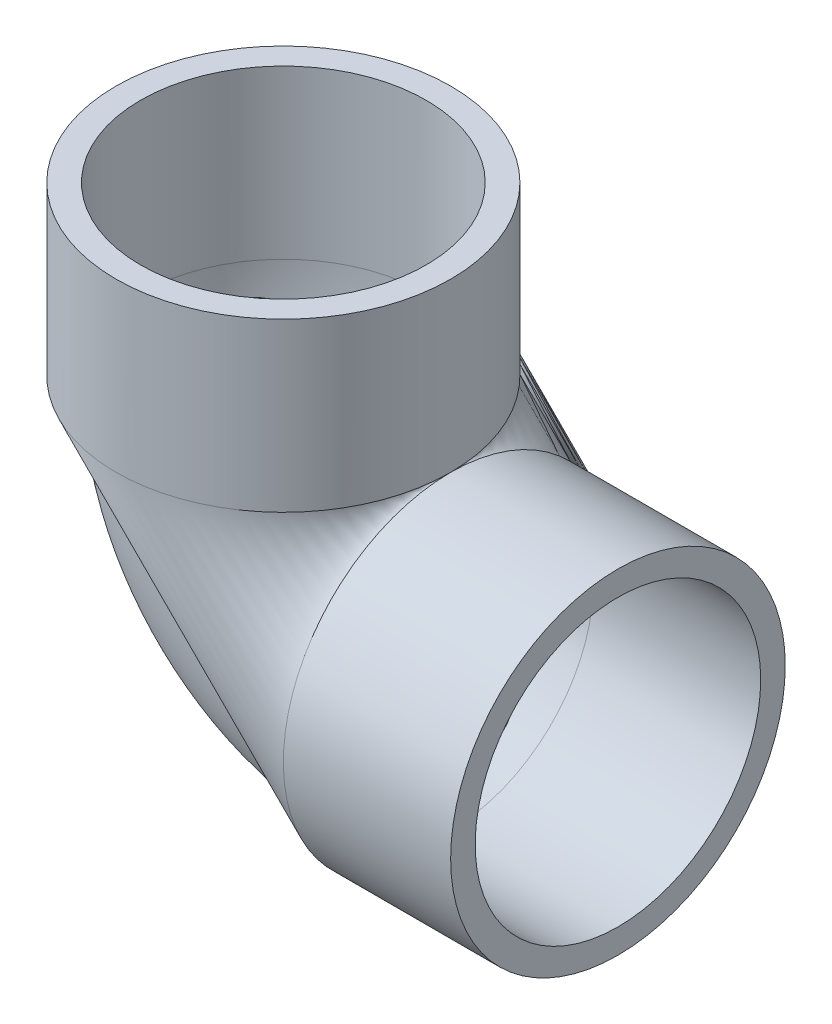
ISO-10303-21;
HEADER;
FILE_DESCRIPTION(('STEP AP214'),'2;1');
FILE_NAME('part.step','',(''),(''),'','','');
FILE_SCHEMA(('AUTOMOTIVE_DESIGN { 1 0 10303 214 1 1 1 1 }'));
ENDSEC;
DATA;
#1=APPLICATION_CONTEXT('core data for automotive mechanical design processes');
#2=APPLICATION_PROTOCOL_DEFINITION('international standard','automotive_design',2000,#1);
#3=PRODUCT_CONTEXT('',#1,'mechanical');
#4=PRODUCT('Part','Part','',(#3));
#5=PRODUCT_RELATED_PRODUCT_CATEGORY('part','',(#4));
#6=PRODUCT_DEFINITION_FORMATION('','',#4);
#7=PRODUCT_DEFINITION_CONTEXT('part definition',#1,'design');
#8=PRODUCT_DEFINITION('design','',#6,#7);
#9=PRODUCT_DEFINITION_SHAPE('','',#8);
#10=(LENGTH_UNIT() NAMED_UNIT(*) SI_UNIT(.MILLI.,.METRE.));
#11=(NAMED_UNIT(*) PLANE_ANGLE_UNIT() SI_UNIT($,.RADIAN.));
#12=(NAMED_UNIT(*) SI_UNIT($,.STERADIAN.) SOLID_ANGLE_UNIT());
#13=UNCERTAINTY_MEASURE_WITH_UNIT(LENGTH_MEASURE(1.E-05),#10,'distance_accuracy_value','');
#14=(GEOMETRIC_REPRESENTATION_CONTEXT(3) GLOBAL_UNCERTAINTY_ASSIGNED_CONTEXT((#13)) GLOBAL_UNIT_ASSIGNED_CONTEXT((#10,
#11,#12)) REPRESENTATION_CONTEXT('',''));
#15=CARTESIAN_POINT('',(0.,0.,0.));
#16=DIRECTION('',(0.,0.,1.));
#17=DIRECTION('',(1.,0.,0.));
#18=AXIS2_PLACEMENT_3D('',#15,#16,#17);
#19=CARTESIAN_POINT('',(0.,15.,0.));
#20=DIRECTION('',(0.,-1.,0.));
#21=DIRECTION('',(0.,0.,-1.));
#22=AXIS2_PLACEMENT_3D('',#19,#20,#21);
#23=CYLINDRICAL_SURFACE('',#22,15.);
#24=CARTESIAN_POINT('',(0.,15.,0.));
#25=DIRECTION('',(0.,1.,0.));
#26=DIRECTION('',(0.,0.,1.));
#27=AXIS2_PLACEMENT_3D('',#24,#25,#26);
#28=CIRCLE('',#27,15.);
#29=CARTESIAN_POINT('',(0.,15.,15.));
#30=VERTEX_POINT('',#29);
#31=EDGE_CURVE('E11',#30,#30,#28,.T.);
#32=ORIENTED_EDGE('',*,*,#31,.F.);
#33=EDGE_LOOP('',(#32));
#34=FACE_BOUND('',#33,.T.);
#35=CARTESIAN_POINT('',(0.,0.,0.));
#36=DIRECTION('',(0.,1.,0.));
#37=DIRECTION('',(0.,0.,1.));
#38=AXIS2_PLACEMENT_3D('',#35,#36,#37);
#39=CIRCLE('',#38,15.);
#40=CARTESIAN_POINT('',(15.,0.,0.));
#41=VERTEX_POINT('',#40);
#42=EDGE_CURVE('E46',#41,#41,#39,.T.);
#43=ORIENTED_EDGE('',*,*,#42,.T.);
#44=EDGE_LOOP('',(#43));
#45=FACE_BOUND('',#44,.T.);
#46=ADVANCED_FACE('F38',(#34,#45),#23,.T.);
#47=CARTESIAN_POINT('',(0.,15.,0.));
#48=DIRECTION('',(0.,1.,0.));
#49=DIRECTION('',(0.,0.,1.));
#50=AXIS2_PLACEMENT_3D('',#47,#48,#49);
#51=PLANE('',#50);
#52=CARTESIAN_POINT('',(0.,15.,0.));
#53=DIRECTION('',(0.,1.,0.));
#54=DIRECTION('',(0.,0.,1.));
#55=AXIS2_PLACEMENT_3D('',#52,#53,#54);
#56=CIRCLE('',#55,12.8);
#57=CARTESIAN_POINT('',(0.,15.,12.8));
#58=VERTEX_POINT('',#57);
#59=EDGE_CURVE('E57',#58,#58,#56,.T.);
#60=ORIENTED_EDGE('',*,*,#59,.F.);
#61=EDGE_LOOP('',(#60));
#62=FACE_BOUND('',#61,.T.);
#63=ORIENTED_EDGE('',*,*,#31,.T.);
#64=EDGE_LOOP('',(#63));
#65=FACE_BOUND('',#64,.T.);
#66=ADVANCED_FACE('F74',(#62,#65),#51,.T.);
#67=CARTESIAN_POINT('',(15.,0.,0.));
#68=DIRECTION('',(0.,0.,1.));
#69=DIRECTION('',(1.,0.,0.));
#70=AXIS2_PLACEMENT_3D('',#67,#68,#69);
#71=DEGENERATE_TOROIDAL_SURFACE('',#70,15.,15.,.T.);
#72=CARTESIAN_POINT('',(15.,-15.,0.));
#73=DIRECTION('',(1.,0.,0.));
#74=DIRECTION('',(0.,0.,-1.));
#75=AXIS2_PLACEMENT_3D('',#72,#73,#74);
#76=CIRCLE('',#75,15.);
#77=EDGE_CURVE('E51',#41,#41,#76,.T.);
#78=ORIENTED_EDGE('',*,*,#77,.F.);
#79=ORIENTED_EDGE('',*,*,#42,.F.);
#80=EDGE_LOOP('',(#78,#79));
#81=FACE_BOUND('',#80,.T.);
#82=ADVANCED_FACE('F72',(#81),#71,.T.);
#83=CARTESIAN_POINT('',(30.,-15.,0.));
#84=DIRECTION('',(-1.,0.,0.));
#85=DIRECTION('',(0.,0.,1.));
#86=AXIS2_PLACEMENT_3D('',#83,#84,#85);
#87=CYLINDRICAL_SURFACE('',#86,15.);
#88=CARTESIAN_POINT('',(30.,-15.,0.));
#89=DIRECTION('',(1.,0.,0.));
#90=DIRECTION('',(0.,0.,-1.));
#91=AXIS2_PLACEMENT_3D('',#88,#89,#90);
#92=CIRCLE('',#91,15.);
#93=CARTESIAN_POINT('',(30.,-15.,-15.));
#94=VERTEX_POINT('',#93);
#95=EDGE_CURVE('E56',#94,#94,#92,.T.);
#96=ORIENTED_EDGE('',*,*,#95,.F.);
#97=EDGE_LOOP('',(#96));
#98=FACE_BOUND('',#97,.T.);
#99=ORIENTED_EDGE('',*,*,#77,.T.);
#100=EDGE_LOOP('',(#99));
#101=FACE_BOUND('',#100,.T.);
#102=ADVANCED_FACE('F52',(#98,#101),#87,.T.);
#103=CARTESIAN_POINT('',(30.,-15.,0.));
#104=DIRECTION('',(1.,0.,0.));
#105=DIRECTION('',(0.,0.,-1.));
#106=AXIS2_PLACEMENT_3D('',#103,#104,#105);
#107=PLANE('',#106);
#108=CARTESIAN_POINT('',(30.,-15.,0.));
#109=DIRECTION('',(1.,0.,0.));
#110=DIRECTION('',(0.,0.,-1.));
#111=AXIS2_PLACEMENT_3D('',#108,#109,#110);
#112=CIRCLE('',#111,12.8);
#113=CARTESIAN_POINT('',(30.,-15.,-12.8));
#114=VERTEX_POINT('',#113);
#115=EDGE_CURVE('E142',#114,#114,#112,.T.);
#116=ORIENTED_EDGE('',*,*,#115,.F.);
#117=EDGE_LOOP('',(#116));
#118=FACE_BOUND('',#117,.T.);
#119=ORIENTED_EDGE('',*,*,#95,.T.);
#120=EDGE_LOOP('',(#119));
#121=FACE_BOUND('',#120,.T.);
#122=ADVANCED_FACE('F80',(#118,#121),#107,.T.);
#123=CARTESIAN_POINT('',(0.,15.,0.));
#124=DIRECTION('',(0.,-1.,0.));
#125=DIRECTION('',(0.,0.,-1.));
#126=AXIS2_PLACEMENT_3D('',#123,#124,#125);
#127=CYLINDRICAL_SURFACE('',#126,12.8);
#128=ORIENTED_EDGE('',*,*,#59,.T.);
#129=EDGE_LOOP('',(#128));
#130=FACE_BOUND('',#129,.T.);
#131=CARTESIAN_POINT('',(0.,0.,0.));
#132=DIRECTION('',(0.,-1.,0.));
#133=DIRECTION('',(0.,0.,-1.));
#134=AXIS2_PLACEMENT_3D('',#131,#132,#133);
#135=CIRCLE('',#134,12.8);
#136=CARTESIAN_POINT('',(-12.8,0.,0.));
#137=VERTEX_POINT('',#136);
#138=EDGE_CURVE('E64',#137,#137,#135,.F.);
#139=ORIENTED_EDGE('',*,*,#138,.F.);
#140=EDGE_LOOP('',(#139));
#141=FACE_BOUND('',#140,.T.);
#142=ADVANCED_FACE('F105',(#130,#141),#127,.F.);
#143=CARTESIAN_POINT('',(15.,0.,0.));
#144=DIRECTION('',(0.,0.,1.));
#145=DIRECTION('',(1.,0.,0.));
#146=AXIS2_PLACEMENT_3D('',#143,#144,#145);
#147=TOROIDAL_SURFACE('',#146,15.,12.8);
#148=CARTESIAN_POINT('',(15.,-15.,0.));
#149=DIRECTION('',(-1.,0.,0.));
#150=DIRECTION('',(0.,0.,1.));
#151=AXIS2_PLACEMENT_3D('',#148,#149,#150);
#152=CIRCLE('',#151,12.8);
#153=CARTESIAN_POINT('',(15.,-27.8,0.));
#154=VERTEX_POINT('',#153);
#155=EDGE_CURVE('E145',#154,#154,#152,.F.);
#156=CARTESIAN_POINT('',(15.,0.,0.));
#157=DIRECTION('',(0.,0.,1.));
#158=DIRECTION('',(1.,0.,0.));
#159=AXIS2_PLACEMENT_3D('',#156,#157,#158);
#160=CIRCLE('',#159,27.8);
#161=EDGE_CURVE('',#137,#154,#160,.T.);
#162=ORIENTED_EDGE('',*,*,#138,.T.);
#163=ORIENTED_EDGE('',*,*,#155,.T.);
#164=ORIENTED_EDGE('',*,*,#161,.T.);
#165=ORIENTED_EDGE('',*,*,#161,.F.);
#166=EDGE_LOOP('',(#162,#164,#163,#165));
#167=FACE_BOUND('',#166,.T.);
#168=ADVANCED_FACE('F114',(#167),#147,.F.);
#169=CARTESIAN_POINT('',(30.,-15.,0.));
#170=DIRECTION('',(-1.,0.,0.));
#171=DIRECTION('',(0.,0.,1.));
#172=AXIS2_PLACEMENT_3D('',#169,#170,#171);
#173=CYLINDRICAL_SURFACE('',#172,12.8);
#174=ORIENTED_EDGE('',*,*,#115,.T.);
#175=EDGE_LOOP('',(#174));
#176=FACE_BOUND('',#175,.T.);
#177=ORIENTED_EDGE('',*,*,#155,.F.);
#178=EDGE_LOOP('',(#177));
#179=FACE_BOUND('',#178,.T.);
#180=ADVANCED_FACE('F123',(#176,#179),#173,.F.);
#181=CLOSED_SHELL('',(#46,#66,#82,#102,#122,#142,#168,#180));
#182=MANIFOLD_SOLID_BREP('B2',#181);
#183=ADVANCED_BREP_SHAPE_REPRESENTATION('',(#18,#182),#14);
#184=SHAPE_DEFINITION_REPRESENTATION(#9,#183);
ENDSEC;
END-ISO-10303-21;
